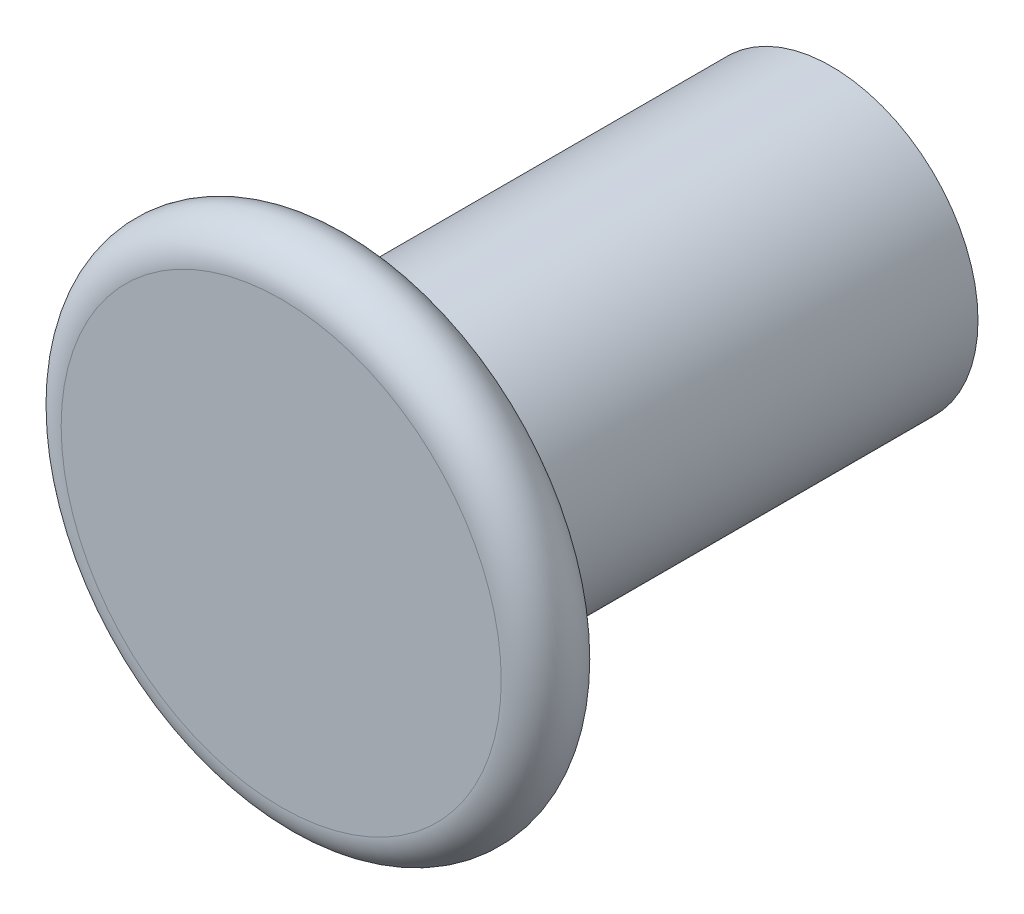
ISO-10303-21;
HEADER;
FILE_DESCRIPTION(('STEP AP214'),'2;1');
FILE_NAME('part.step','',(''),(''),'','','');
FILE_SCHEMA(('AUTOMOTIVE_DESIGN { 1 0 10303 214 1 1 1 1 }'));
ENDSEC;
DATA;
#1=APPLICATION_CONTEXT('core data for automotive mechanical design processes');
#2=APPLICATION_PROTOCOL_DEFINITION('international standard','automotive_design',2000,#1);
#3=PRODUCT_CONTEXT('',#1,'mechanical');
#4=PRODUCT('Part','Part','',(#3));
#5=PRODUCT_RELATED_PRODUCT_CATEGORY('part','',(#4));
#6=PRODUCT_DEFINITION_FORMATION('','',#4);
#7=PRODUCT_DEFINITION_CONTEXT('part definition',#1,'design');
#8=PRODUCT_DEFINITION('design','',#6,#7);
#9=PRODUCT_DEFINITION_SHAPE('','',#8);
#10=(LENGTH_UNIT() NAMED_UNIT(*) SI_UNIT(.MILLI.,.METRE.));
#11=(NAMED_UNIT(*) PLANE_ANGLE_UNIT() SI_UNIT($,.RADIAN.));
#12=(NAMED_UNIT(*) SI_UNIT($,.STERADIAN.) SOLID_ANGLE_UNIT());
#13=UNCERTAINTY_MEASURE_WITH_UNIT(LENGTH_MEASURE(1.E-05),#10,'distance_accuracy_value','');
#14=(GEOMETRIC_REPRESENTATION_CONTEXT(3) GLOBAL_UNCERTAINTY_ASSIGNED_CONTEXT((#13)) GLOBAL_UNIT_ASSIGNED_CONTEXT((#10,
#11,#12)) REPRESENTATION_CONTEXT('',''));
#15=CARTESIAN_POINT('',(0.,0.,0.));
#16=DIRECTION('',(0.,0.,1.));
#17=DIRECTION('',(1.,0.,0.));
#18=AXIS2_PLACEMENT_3D('',#15,#16,#17);
#19=CARTESIAN_POINT('',(0.,0.,60.));
#20=DIRECTION('',(0.,0.,-1.));
#21=DIRECTION('',(-1.,0.,0.));
#22=AXIS2_PLACEMENT_3D('',#19,#20,#21);
#23=CYLINDRICAL_SURFACE('',#22,20.);
#24=CARTESIAN_POINT('',(0.,0.,60.));
#25=DIRECTION('',(0.,0.,1.));
#26=DIRECTION('',(1.,0.,0.));
#27=AXIS2_PLACEMENT_3D('',#24,#25,#26);
#28=CIRCLE('',#27,20.);
#29=CARTESIAN_POINT('',(20.,0.,60.));
#30=VERTEX_POINT('',#29);
#31=EDGE_CURVE('E45',#30,#30,#28,.T.);
#32=ORIENTED_EDGE('',*,*,#31,.F.);
#33=EDGE_LOOP('',(#32));
#34=FACE_BOUND('',#33,.T.);
#35=CARTESIAN_POINT('',(0.,0.,0.));
#36=DIRECTION('',(0.,0.,1.));
#37=DIRECTION('',(1.,0.,0.));
#38=AXIS2_PLACEMENT_3D('',#35,#36,#37);
#39=CIRCLE('',#38,20.);
#40=CARTESIAN_POINT('',(20.,0.,0.));
#41=VERTEX_POINT('',#40);
#42=EDGE_CURVE('E40',#41,#41,#39,.T.);
#43=ORIENTED_EDGE('',*,*,#42,.T.);
#44=EDGE_LOOP('',(#43));
#45=FACE_BOUND('',#44,.T.);
#46=ADVANCED_FACE('F37',(#34,#45),#23,.T.);
#47=CARTESIAN_POINT('',(0.,0.,60.));
#48=DIRECTION('',(0.,0.,1.));
#49=DIRECTION('',(1.,0.,0.));
#50=AXIS2_PLACEMENT_3D('',#47,#48,#49);
#51=PLANE('',#50);
#52=CARTESIAN_POINT('',(0.,0.,60.));
#53=DIRECTION('',(0.,0.,1.));
#54=DIRECTION('',(1.,0.,0.));
#55=AXIS2_PLACEMENT_3D('',#52,#53,#54);
#56=CIRCLE('',#55,10.);
#57=CARTESIAN_POINT('',(10.,0.,60.));
#58=VERTEX_POINT('',#57);
#59=EDGE_CURVE('E10',#58,#58,#56,.T.);
#60=ORIENTED_EDGE('',*,*,#59,.F.);
#61=EDGE_LOOP('',(#60));
#62=FACE_BOUND('',#61,.T.);
#63=ORIENTED_EDGE('',*,*,#31,.T.);
#64=EDGE_LOOP('',(#63));
#65=FACE_BOUND('',#64,.T.);
#66=ADVANCED_FACE('F77',(#62,#65),#51,.T.);
#67=CARTESIAN_POINT('',(0.,0.,0.));
#68=DIRECTION('',(0.,0.,1.));
#69=DIRECTION('',(1.,0.,0.));
#70=AXIS2_PLACEMENT_3D('',#67,#68,#69);
#71=PLANE('',#70);
#72=ORIENTED_EDGE('',*,*,#42,.F.);
#73=EDGE_LOOP('',(#72));
#74=FACE_BOUND('',#73,.T.);
#75=ADVANCED_FACE('F82',(#74),#71,.F.);
#76=CARTESIAN_POINT('',(0.,0.,65.));
#77=DIRECTION('',(0.,0.,-1.));
#78=DIRECTION('',(-1.,0.,0.));
#79=AXIS2_PLACEMENT_3D('',#76,#77,#78);
#80=CYLINDRICAL_SURFACE('',#79,10.);
#81=CARTESIAN_POINT('',(0.,0.,65.));
#82=DIRECTION('',(0.,0.,1.));
#83=DIRECTION('',(1.,0.,0.));
#84=AXIS2_PLACEMENT_3D('',#81,#82,#83);
#85=CIRCLE('',#84,10.);
#86=CARTESIAN_POINT('',(10.,0.,65.));
#87=VERTEX_POINT('',#86);
#88=EDGE_CURVE('E52',#87,#87,#85,.T.);
#89=ORIENTED_EDGE('',*,*,#88,.F.);
#90=EDGE_LOOP('',(#89));
#91=FACE_BOUND('',#90,.T.);
#92=ORIENTED_EDGE('',*,*,#59,.T.);
#93=EDGE_LOOP('',(#92));
#94=FACE_BOUND('',#93,.T.);
#95=ADVANCED_FACE('F92',(#91,#94),#80,.T.);
#96=CARTESIAN_POINT('',(0.,0.,65.));
#97=DIRECTION('',(0.,0.,-1.));
#98=DIRECTION('',(-1.,0.,0.));
#99=AXIS2_PLACEMENT_3D('',#96,#97,#98);
#100=PLANE('',#99);
#101=ORIENTED_EDGE('',*,*,#88,.T.);
#102=EDGE_LOOP('',(#101));
#103=FACE_BOUND('',#102,.T.);
#104=CARTESIAN_POINT('',(0.,0.,65.));
#105=DIRECTION('',(0.,0.,-1.));
#106=DIRECTION('',(-1.,0.,0.));
#107=AXIS2_PLACEMENT_3D('',#104,#105,#106);
#108=CIRCLE('',#107,30.);
#109=CARTESIAN_POINT('',(-30.,0.,65.));
#110=VERTEX_POINT('',#109);
#111=EDGE_CURVE('E56',#110,#110,#108,.T.);
#112=ORIENTED_EDGE('',*,*,#111,.T.);
#113=EDGE_LOOP('',(#112));
#114=FACE_BOUND('',#113,.T.);
#115=ADVANCED_FACE('F74',(#103,#114),#100,.T.);
#116=CARTESIAN_POINT('',(0.,0.,70.));
#117=DIRECTION('',(0.,0.,-1.));
#118=DIRECTION('',(-1.,0.,0.));
#119=AXIS2_PLACEMENT_3D('',#116,#117,#118);
#120=TOROIDAL_SURFACE('',#119,30.,5.);
#121=CARTESIAN_POINT('',(0.,0.,75.));
#122=DIRECTION('',(0.,0.,-1.));
#123=DIRECTION('',(-1.,0.,0.));
#124=AXIS2_PLACEMENT_3D('',#121,#122,#123);
#125=CIRCLE('',#124,30.);
#126=CARTESIAN_POINT('',(-30.,0.,75.));
#127=VERTEX_POINT('',#126);
#128=EDGE_CURVE('E60',#127,#127,#125,.T.);
#129=ORIENTED_EDGE('',*,*,#128,.T.);
#130=EDGE_LOOP('',(#129));
#131=FACE_BOUND('',#130,.T.);
#132=ORIENTED_EDGE('',*,*,#111,.F.);
#133=EDGE_LOOP('',(#132));
#134=FACE_BOUND('',#133,.T.);
#135=ADVANCED_FACE('F65',(#131,#134),#120,.T.);
#136=CARTESIAN_POINT('',(0.,0.,75.));
#137=DIRECTION('',(0.,0.,1.));
#138=DIRECTION('',(1.,0.,0.));
#139=AXIS2_PLACEMENT_3D('',#136,#137,#138);
#140=PLANE('',#139);
#141=ORIENTED_EDGE('',*,*,#128,.F.);
#142=EDGE_LOOP('',(#141));
#143=FACE_BOUND('',#142,.T.);
#144=ADVANCED_FACE('F68',(#143),#140,.T.);
#145=CLOSED_SHELL('',(#46,#66,#75,#95,#115,#135,#144));
#146=MANIFOLD_SOLID_BREP('B2',#145);
#147=ADVANCED_BREP_SHAPE_REPRESENTATION('',(#18,#146),#14);
#148=SHAPE_DEFINITION_REPRESENTATION(#9,#147);
ENDSEC;
END-ISO-10303-21;
